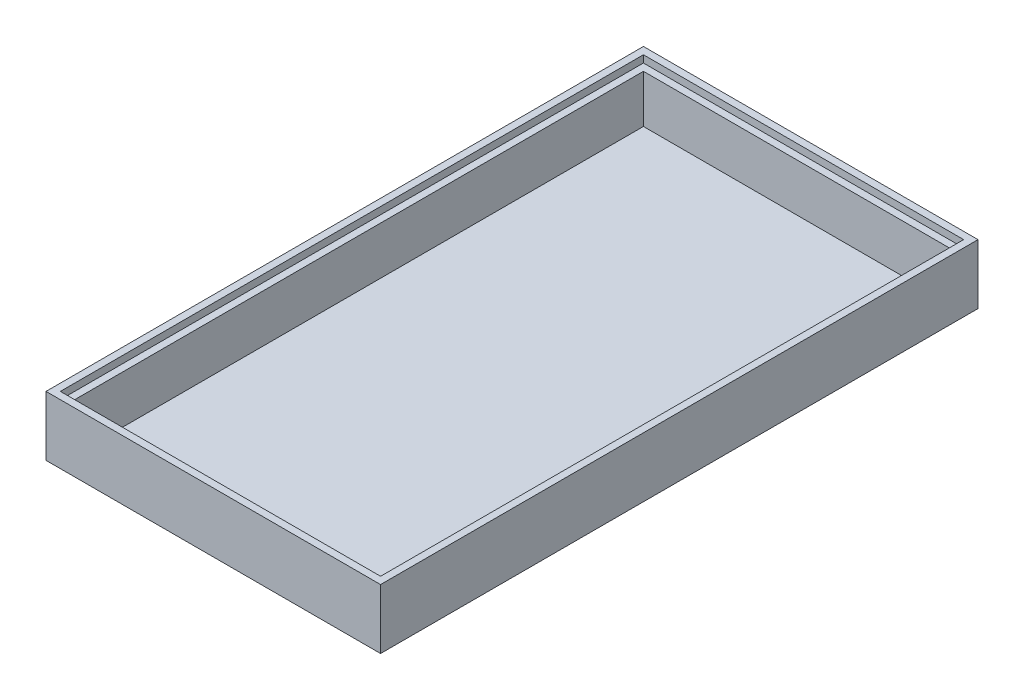
ISO-10303-21;
HEADER;
FILE_DESCRIPTION(('STEP AP214'),'2;1');
FILE_NAME('part.step','',(''),(''),'','','');
FILE_SCHEMA(('AUTOMOTIVE_DESIGN { 1 0 10303 214 1 1 1 1 }'));
ENDSEC;
DATA;
#1=APPLICATION_CONTEXT('core data for automotive mechanical design processes');
#2=APPLICATION_PROTOCOL_DEFINITION('international standard','automotive_design',2000,#1);
#3=PRODUCT_CONTEXT('',#1,'mechanical');
#4=PRODUCT('Part','Part','',(#3));
#5=PRODUCT_RELATED_PRODUCT_CATEGORY('part','',(#4));
#6=PRODUCT_DEFINITION_FORMATION('','',#4);
#7=PRODUCT_DEFINITION_CONTEXT('part definition',#1,'design');
#8=PRODUCT_DEFINITION('design','',#6,#7);
#9=PRODUCT_DEFINITION_SHAPE('','',#8);
#10=(LENGTH_UNIT() NAMED_UNIT(*) SI_UNIT(.MILLI.,.METRE.));
#11=(NAMED_UNIT(*) PLANE_ANGLE_UNIT() SI_UNIT($,.RADIAN.));
#12=(NAMED_UNIT(*) SI_UNIT($,.STERADIAN.) SOLID_ANGLE_UNIT());
#13=UNCERTAINTY_MEASURE_WITH_UNIT(LENGTH_MEASURE(1.E-05),#10,'distance_accuracy_value','');
#14=(GEOMETRIC_REPRESENTATION_CONTEXT(3) GLOBAL_UNCERTAINTY_ASSIGNED_CONTEXT((#13)) GLOBAL_UNIT_ASSIGNED_CONTEXT((#10,
#11,#12)) REPRESENTATION_CONTEXT('',''));
#15=CARTESIAN_POINT('',(0.,0.,0.));
#16=DIRECTION('',(0.,0.,1.));
#17=DIRECTION('',(1.,0.,0.));
#18=AXIS2_PLACEMENT_3D('',#15,#16,#17);
#19=CARTESIAN_POINT('',(-70.,25.,125.));
#20=DIRECTION('',(1.,0.,0.));
#21=DIRECTION('',(0.,0.,-1.));
#22=AXIS2_PLACEMENT_3D('',#19,#20,#21);
#23=PLANE('',#22);
#24=DIRECTION('',(0.,0.,1.));
#25=VECTOR('',#24,1.);
#26=CARTESIAN_POINT('',(-70.,0.,125.));
#27=LINE('',#26,#25);
#28=CARTESIAN_POINT('',(-70.,0.,-125.));
#29=VERTEX_POINT('',#28);
#30=CARTESIAN_POINT('',(-70.,0.,125.));
#31=VERTEX_POINT('',#30);
#32=EDGE_CURVE('E182',#29,#31,#27,.T.);
#33=ORIENTED_EDGE('',*,*,#32,.T.);
#34=DIRECTION('',(0.,-1.,0.));
#35=VECTOR('',#34,1.);
#36=CARTESIAN_POINT('',(-70.,25.,125.));
#37=LINE('',#36,#35);
#38=CARTESIAN_POINT('',(-70.,25.,125.));
#39=VERTEX_POINT('',#38);
#40=EDGE_CURVE('E41',#39,#31,#37,.T.);
#41=ORIENTED_EDGE('',*,*,#40,.F.);
#42=DIRECTION('',(0.,0.,1.));
#43=VECTOR('',#42,1.);
#44=CARTESIAN_POINT('',(-70.,25.,125.));
#45=LINE('',#44,#43);
#46=CARTESIAN_POINT('',(-70.,25.,-125.));
#47=VERTEX_POINT('',#46);
#48=EDGE_CURVE('E191',#47,#39,#45,.T.);
#49=ORIENTED_EDGE('',*,*,#48,.F.);
#50=DIRECTION('',(0.,-1.,0.));
#51=VECTOR('',#50,1.);
#52=CARTESIAN_POINT('',(-70.,25.,-125.));
#53=LINE('',#52,#51);
#54=EDGE_CURVE('E201',#47,#29,#53,.T.);
#55=ORIENTED_EDGE('',*,*,#54,.T.);
#56=EDGE_LOOP('',(#33,#41,#49,#55));
#57=FACE_BOUND('',#56,.T.);
#58=ADVANCED_FACE('F34',(#57),#23,.F.);
#59=CARTESIAN_POINT('',(70.,25.,125.));
#60=DIRECTION('',(0.,0.,-1.));
#61=DIRECTION('',(-1.,0.,0.));
#62=AXIS2_PLACEMENT_3D('',#59,#60,#61);
#63=PLANE('',#62);
#64=DIRECTION('',(1.,0.,0.));
#65=VECTOR('',#64,1.);
#66=CARTESIAN_POINT('',(70.,0.,125.));
#67=LINE('',#66,#65);
#68=CARTESIAN_POINT('',(70.,0.,125.));
#69=VERTEX_POINT('',#68);
#70=EDGE_CURVE('E204',#31,#69,#67,.T.);
#71=ORIENTED_EDGE('',*,*,#70,.T.);
#72=DIRECTION('',(0.,-1.,0.));
#73=VECTOR('',#72,1.);
#74=CARTESIAN_POINT('',(70.,25.,125.));
#75=LINE('',#74,#73);
#76=CARTESIAN_POINT('',(70.,25.,125.));
#77=VERTEX_POINT('',#76);
#78=EDGE_CURVE('E214',#77,#69,#75,.T.);
#79=ORIENTED_EDGE('',*,*,#78,.F.);
#80=DIRECTION('',(1.,0.,0.));
#81=VECTOR('',#80,1.);
#82=CARTESIAN_POINT('',(70.,25.,125.));
#83=LINE('',#82,#81);
#84=EDGE_CURVE('E194',#39,#77,#83,.T.);
#85=ORIENTED_EDGE('',*,*,#84,.F.);
#86=ORIENTED_EDGE('',*,*,#40,.T.);
#87=EDGE_LOOP('',(#71,#79,#85,#86));
#88=FACE_BOUND('',#87,.T.);
#89=ADVANCED_FACE('F219',(#88),#63,.F.);
#90=CARTESIAN_POINT('',(70.,25.,125.));
#91=DIRECTION('',(-1.,0.,0.));
#92=DIRECTION('',(0.,0.,1.));
#93=AXIS2_PLACEMENT_3D('',#90,#91,#92);
#94=PLANE('',#93);
#95=DIRECTION('',(0.,0.,-1.));
#96=VECTOR('',#95,1.);
#97=CARTESIAN_POINT('',(70.,0.,125.));
#98=LINE('',#97,#96);
#99=CARTESIAN_POINT('',(70.,0.,-125.));
#100=VERTEX_POINT('',#99);
#101=EDGE_CURVE('E206',#69,#100,#98,.T.);
#102=ORIENTED_EDGE('',*,*,#101,.T.);
#103=DIRECTION('',(0.,-1.,0.));
#104=VECTOR('',#103,1.);
#105=CARTESIAN_POINT('',(70.,25.,-125.));
#106=LINE('',#105,#104);
#107=CARTESIAN_POINT('',(70.,25.,-125.));
#108=VERTEX_POINT('',#107);
#109=EDGE_CURVE('E211',#108,#100,#106,.T.);
#110=ORIENTED_EDGE('',*,*,#109,.F.);
#111=DIRECTION('',(0.,0.,-1.));
#112=VECTOR('',#111,1.);
#113=CARTESIAN_POINT('',(70.,25.,125.));
#114=LINE('',#113,#112);
#115=EDGE_CURVE('E197',#77,#108,#114,.T.);
#116=ORIENTED_EDGE('',*,*,#115,.F.);
#117=ORIENTED_EDGE('',*,*,#78,.T.);
#118=EDGE_LOOP('',(#102,#110,#116,#117));
#119=FACE_BOUND('',#118,.T.);
#120=ADVANCED_FACE('F231',(#119),#94,.F.);
#121=CARTESIAN_POINT('',(70.,25.,-125.));
#122=DIRECTION('',(0.,0.,1.));
#123=DIRECTION('',(1.,0.,0.));
#124=AXIS2_PLACEMENT_3D('',#121,#122,#123);
#125=PLANE('',#124);
#126=DIRECTION('',(-1.,0.,0.));
#127=VECTOR('',#126,1.);
#128=CARTESIAN_POINT('',(70.,0.,-125.));
#129=LINE('',#128,#127);
#130=EDGE_CURVE('E195',#100,#29,#129,.T.);
#131=ORIENTED_EDGE('',*,*,#130,.T.);
#132=ORIENTED_EDGE('',*,*,#54,.F.);
#133=DIRECTION('',(-1.,0.,0.));
#134=VECTOR('',#133,1.);
#135=CARTESIAN_POINT('',(70.,25.,-125.));
#136=LINE('',#135,#134);
#137=EDGE_CURVE('E199',#108,#47,#136,.T.);
#138=ORIENTED_EDGE('',*,*,#137,.F.);
#139=ORIENTED_EDGE('',*,*,#109,.T.);
#140=EDGE_LOOP('',(#131,#132,#138,#139));
#141=FACE_BOUND('',#140,.T.);
#142=ADVANCED_FACE('F235',(#141),#125,.F.);
#143=CARTESIAN_POINT('',(0.,25.,0.));
#144=DIRECTION('',(0.,1.,0.));
#145=DIRECTION('',(0.,0.,1.));
#146=AXIS2_PLACEMENT_3D('',#143,#144,#145);
#147=PLANE('',#146);
#148=DIRECTION('',(0.,0.,1.));
#149=VECTOR('',#148,1.);
#150=CARTESIAN_POINT('',(-67.,25.,-122.));
#151=LINE('',#150,#149);
#152=CARTESIAN_POINT('',(-67.,25.,-122.));
#153=VERTEX_POINT('',#152);
#154=CARTESIAN_POINT('',(-67.,25.,122.));
#155=VERTEX_POINT('',#154);
#156=EDGE_CURVE('E48',#153,#155,#151,.T.);
#157=ORIENTED_EDGE('',*,*,#156,.F.);
#158=DIRECTION('',(-1.,0.,0.));
#159=VECTOR('',#158,1.);
#160=CARTESIAN_POINT('',(67.,25.,-122.));
#161=LINE('',#160,#159);
#162=CARTESIAN_POINT('',(67.,25.,-122.));
#163=VERTEX_POINT('',#162);
#164=EDGE_CURVE('E141',#163,#153,#161,.T.);
#165=ORIENTED_EDGE('',*,*,#164,.F.);
#166=DIRECTION('',(0.,0.,-1.));
#167=VECTOR('',#166,1.);
#168=CARTESIAN_POINT('',(67.,25.,-122.));
#169=LINE('',#168,#167);
#170=CARTESIAN_POINT('',(67.,25.,122.));
#171=VERTEX_POINT('',#170);
#172=EDGE_CURVE('E144',#171,#163,#169,.T.);
#173=ORIENTED_EDGE('',*,*,#172,.F.);
#174=DIRECTION('',(1.,0.,0.));
#175=VECTOR('',#174,1.);
#176=CARTESIAN_POINT('',(67.,25.,122.));
#177=LINE('',#176,#175);
#178=EDGE_CURVE('E150',#155,#171,#177,.T.);
#179=ORIENTED_EDGE('',*,*,#178,.F.);
#180=EDGE_LOOP('',(#157,#165,#173,#179));
#181=FACE_BOUND('',#180,.T.);
#182=ORIENTED_EDGE('',*,*,#48,.T.);
#183=ORIENTED_EDGE('',*,*,#84,.T.);
#184=ORIENTED_EDGE('',*,*,#115,.T.);
#185=ORIENTED_EDGE('',*,*,#137,.T.);
#186=EDGE_LOOP('',(#182,#183,#184,#185));
#187=FACE_BOUND('',#186,.T.);
#188=ADVANCED_FACE('F237',(#181,#187),#147,.T.);
#189=CARTESIAN_POINT('',(0.,0.,0.));
#190=DIRECTION('',(0.,1.,0.));
#191=DIRECTION('',(0.,0.,1.));
#192=AXIS2_PLACEMENT_3D('',#189,#190,#191);
#193=PLANE('',#192);
#194=ORIENTED_EDGE('',*,*,#32,.F.);
#195=ORIENTED_EDGE('',*,*,#130,.F.);
#196=ORIENTED_EDGE('',*,*,#101,.F.);
#197=ORIENTED_EDGE('',*,*,#70,.F.);
#198=EDGE_LOOP('',(#194,#195,#196,#197));
#199=FACE_BOUND('',#198,.T.);
#200=ADVANCED_FACE('F227',(#199),#193,.F.);
#201=CARTESIAN_POINT('',(0.,22.,0.));
#202=DIRECTION('',(0.,-1.,0.));
#203=DIRECTION('',(0.,0.,-1.));
#204=AXIS2_PLACEMENT_3D('',#201,#202,#203);
#205=PLANE('',#204);
#206=DIRECTION('',(0.,0.,1.));
#207=VECTOR('',#206,1.);
#208=CARTESIAN_POINT('',(-67.,22.,-122.));
#209=LINE('',#208,#207);
#210=CARTESIAN_POINT('',(-67.,22.,-122.));
#211=VERTEX_POINT('',#210);
#212=CARTESIAN_POINT('',(-67.,22.,122.));
#213=VERTEX_POINT('',#212);
#214=EDGE_CURVE('E123',#211,#213,#209,.T.);
#215=ORIENTED_EDGE('',*,*,#214,.T.);
#216=DIRECTION('',(1.,0.,0.));
#217=VECTOR('',#216,1.);
#218=CARTESIAN_POINT('',(67.,22.,122.));
#219=LINE('',#218,#217);
#220=CARTESIAN_POINT('',(67.,22.,122.));
#221=VERTEX_POINT('',#220);
#222=EDGE_CURVE('E132',#213,#221,#219,.T.);
#223=ORIENTED_EDGE('',*,*,#222,.T.);
#224=DIRECTION('',(0.,0.,-1.));
#225=VECTOR('',#224,1.);
#226=CARTESIAN_POINT('',(67.,22.,-122.));
#227=LINE('',#226,#225);
#228=CARTESIAN_POINT('',(67.,22.,-122.));
#229=VERTEX_POINT('',#228);
#230=EDGE_CURVE('E137',#221,#229,#227,.T.);
#231=ORIENTED_EDGE('',*,*,#230,.T.);
#232=DIRECTION('',(-1.,0.,0.));
#233=VECTOR('',#232,1.);
#234=CARTESIAN_POINT('',(67.,22.,-122.));
#235=LINE('',#234,#233);
#236=EDGE_CURVE('E129',#229,#211,#235,.T.);
#237=ORIENTED_EDGE('',*,*,#236,.T.);
#238=EDGE_LOOP('',(#215,#223,#231,#237));
#239=FACE_BOUND('',#238,.T.);
#240=DIRECTION('',(-1.,0.,0.));
#241=VECTOR('',#240,1.);
#242=CARTESIAN_POINT('',(64.,22.,-119.));
#243=LINE('',#242,#241);
#244=CARTESIAN_POINT('',(64.,22.,-119.));
#245=VERTEX_POINT('',#244);
#246=CARTESIAN_POINT('',(-64.,22.,-119.));
#247=VERTEX_POINT('',#246);
#248=EDGE_CURVE('E160',#245,#247,#243,.T.);
#249=ORIENTED_EDGE('',*,*,#248,.F.);
#250=DIRECTION('',(0.,0.,-1.));
#251=VECTOR('',#250,1.);
#252=CARTESIAN_POINT('',(64.,22.,119.));
#253=LINE('',#252,#251);
#254=CARTESIAN_POINT('',(64.,22.,119.));
#255=VERTEX_POINT('',#254);
#256=EDGE_CURVE('E56',#255,#245,#253,.T.);
#257=ORIENTED_EDGE('',*,*,#256,.F.);
#258=DIRECTION('',(1.,0.,0.));
#259=VECTOR('',#258,1.);
#260=CARTESIAN_POINT('',(64.,22.,119.));
#261=LINE('',#260,#259);
#262=CARTESIAN_POINT('',(-64.,22.,119.));
#263=VERTEX_POINT('',#262);
#264=EDGE_CURVE('E11',#263,#255,#261,.T.);
#265=ORIENTED_EDGE('',*,*,#264,.F.);
#266=DIRECTION('',(0.,0.,1.));
#267=VECTOR('',#266,1.);
#268=CARTESIAN_POINT('',(-64.,22.,119.));
#269=LINE('',#268,#267);
#270=EDGE_CURVE('E163',#247,#263,#269,.T.);
#271=ORIENTED_EDGE('',*,*,#270,.F.);
#272=EDGE_LOOP('',(#249,#257,#265,#271));
#273=FACE_BOUND('',#272,.T.);
#274=ADVANCED_FACE('F139',(#239,#273),#205,.F.);
#275=CARTESIAN_POINT('',(-67.,22.,-122.));
#276=DIRECTION('',(-1.,0.,0.));
#277=DIRECTION('',(0.,0.,1.));
#278=AXIS2_PLACEMENT_3D('',#275,#276,#277);
#279=PLANE('',#278);
#280=ORIENTED_EDGE('',*,*,#156,.T.);
#281=DIRECTION('',(0.,1.,0.));
#282=VECTOR('',#281,1.);
#283=CARTESIAN_POINT('',(-67.,22.,122.));
#284=LINE('',#283,#282);
#285=EDGE_CURVE('E119',#213,#155,#284,.T.);
#286=ORIENTED_EDGE('',*,*,#285,.F.);
#287=ORIENTED_EDGE('',*,*,#214,.F.);
#288=DIRECTION('',(0.,1.,0.));
#289=VECTOR('',#288,1.);
#290=CARTESIAN_POINT('',(-67.,22.,-122.));
#291=LINE('',#290,#289);
#292=EDGE_CURVE('E154',#211,#153,#291,.T.);
#293=ORIENTED_EDGE('',*,*,#292,.T.);
#294=EDGE_LOOP('',(#280,#286,#287,#293));
#295=FACE_BOUND('',#294,.T.);
#296=ADVANCED_FACE('F121',(#295),#279,.F.);
#297=CARTESIAN_POINT('',(67.,22.,-122.));
#298=DIRECTION('',(0.,0.,-1.));
#299=DIRECTION('',(-1.,0.,0.));
#300=AXIS2_PLACEMENT_3D('',#297,#298,#299);
#301=PLANE('',#300);
#302=ORIENTED_EDGE('',*,*,#164,.T.);
#303=ORIENTED_EDGE('',*,*,#292,.F.);
#304=ORIENTED_EDGE('',*,*,#236,.F.);
#305=DIRECTION('',(0.,1.,0.));
#306=VECTOR('',#305,1.);
#307=CARTESIAN_POINT('',(67.,22.,-122.));
#308=LINE('',#307,#306);
#309=EDGE_CURVE('E156',#229,#163,#308,.T.);
#310=ORIENTED_EDGE('',*,*,#309,.T.);
#311=EDGE_LOOP('',(#302,#303,#304,#310));
#312=FACE_BOUND('',#311,.T.);
#313=ADVANCED_FACE('F304',(#312),#301,.F.);
#314=CARTESIAN_POINT('',(67.,22.,-122.));
#315=DIRECTION('',(1.,0.,0.));
#316=DIRECTION('',(0.,0.,-1.));
#317=AXIS2_PLACEMENT_3D('',#314,#315,#316);
#318=PLANE('',#317);
#319=ORIENTED_EDGE('',*,*,#172,.T.);
#320=ORIENTED_EDGE('',*,*,#309,.F.);
#321=ORIENTED_EDGE('',*,*,#230,.F.);
#322=DIRECTION('',(0.,1.,0.));
#323=VECTOR('',#322,1.);
#324=CARTESIAN_POINT('',(67.,22.,122.));
#325=LINE('',#324,#323);
#326=EDGE_CURVE('E128',#221,#171,#325,.T.);
#327=ORIENTED_EDGE('',*,*,#326,.T.);
#328=EDGE_LOOP('',(#319,#320,#321,#327));
#329=FACE_BOUND('',#328,.T.);
#330=ADVANCED_FACE('F313',(#329),#318,.F.);
#331=CARTESIAN_POINT('',(67.,22.,122.));
#332=DIRECTION('',(0.,0.,1.));
#333=DIRECTION('',(1.,0.,0.));
#334=AXIS2_PLACEMENT_3D('',#331,#332,#333);
#335=PLANE('',#334);
#336=ORIENTED_EDGE('',*,*,#178,.T.);
#337=ORIENTED_EDGE('',*,*,#326,.F.);
#338=ORIENTED_EDGE('',*,*,#222,.F.);
#339=ORIENTED_EDGE('',*,*,#285,.T.);
#340=EDGE_LOOP('',(#336,#337,#338,#339));
#341=FACE_BOUND('',#340,.T.);
#342=ADVANCED_FACE('F133',(#341),#335,.F.);
#343=CARTESIAN_POINT('',(0.,2.,0.));
#344=DIRECTION('',(0.,1.,0.));
#345=DIRECTION('',(0.,0.,1.));
#346=AXIS2_PLACEMENT_3D('',#343,#344,#345);
#347=PLANE('',#346);
#348=DIRECTION('',(0.,0.,1.));
#349=VECTOR('',#348,1.);
#350=CARTESIAN_POINT('',(-64.,2.,119.));
#351=LINE('',#350,#349);
#352=CARTESIAN_POINT('',(-64.,2.,-119.));
#353=VERTEX_POINT('',#352);
#354=CARTESIAN_POINT('',(-64.,2.,119.));
#355=VERTEX_POINT('',#354);
#356=EDGE_CURVE('E166',#353,#355,#351,.T.);
#357=ORIENTED_EDGE('',*,*,#356,.T.);
#358=DIRECTION('',(1.,0.,0.));
#359=VECTOR('',#358,1.);
#360=CARTESIAN_POINT('',(64.,2.,119.));
#361=LINE('',#360,#359);
#362=CARTESIAN_POINT('',(64.,2.,119.));
#363=VERTEX_POINT('',#362);
#364=EDGE_CURVE('E169',#355,#363,#361,.T.);
#365=ORIENTED_EDGE('',*,*,#364,.T.);
#366=DIRECTION('',(0.,0.,-1.));
#367=VECTOR('',#366,1.);
#368=CARTESIAN_POINT('',(64.,2.,119.));
#369=LINE('',#368,#367);
#370=CARTESIAN_POINT('',(64.,2.,-119.));
#371=VERTEX_POINT('',#370);
#372=EDGE_CURVE('E172',#363,#371,#369,.T.);
#373=ORIENTED_EDGE('',*,*,#372,.T.);
#374=DIRECTION('',(-1.,0.,0.));
#375=VECTOR('',#374,1.);
#376=CARTESIAN_POINT('',(64.,2.,-119.));
#377=LINE('',#376,#375);
#378=EDGE_CURVE('E175',#371,#353,#377,.T.);
#379=ORIENTED_EDGE('',*,*,#378,.T.);
#380=EDGE_LOOP('',(#357,#365,#373,#379));
#381=FACE_BOUND('',#380,.T.);
#382=ADVANCED_FACE('F276',(#381),#347,.T.);
#383=CARTESIAN_POINT('',(64.,2.,119.));
#384=DIRECTION('',(0.,0.,1.));
#385=DIRECTION('',(1.,0.,0.));
#386=AXIS2_PLACEMENT_3D('',#383,#384,#385);
#387=PLANE('',#386);
#388=DIRECTION('',(0.,1.,0.));
#389=VECTOR('',#388,1.);
#390=CARTESIAN_POINT('',(-64.,2.,119.));
#391=LINE('',#390,#389);
#392=EDGE_CURVE('E178',#355,#263,#391,.T.);
#393=ORIENTED_EDGE('',*,*,#392,.T.);
#394=ORIENTED_EDGE('',*,*,#264,.T.);
#395=DIRECTION('',(0.,1.,0.));
#396=VECTOR('',#395,1.);
#397=CARTESIAN_POINT('',(64.,2.,119.));
#398=LINE('',#397,#396);
#399=EDGE_CURVE('E186',#363,#255,#398,.T.);
#400=ORIENTED_EDGE('',*,*,#399,.F.);
#401=ORIENTED_EDGE('',*,*,#364,.F.);
#402=EDGE_LOOP('',(#393,#394,#400,#401));
#403=FACE_BOUND('',#402,.T.);
#404=ADVANCED_FACE('F280',(#403),#387,.F.);
#405=CARTESIAN_POINT('',(64.,2.,119.));
#406=DIRECTION('',(1.,0.,0.));
#407=DIRECTION('',(0.,0.,-1.));
#408=AXIS2_PLACEMENT_3D('',#405,#406,#407);
#409=PLANE('',#408);
#410=ORIENTED_EDGE('',*,*,#399,.T.);
#411=ORIENTED_EDGE('',*,*,#256,.T.);
#412=DIRECTION('',(0.,1.,0.));
#413=VECTOR('',#412,1.);
#414=CARTESIAN_POINT('',(64.,2.,-119.));
#415=LINE('',#414,#413);
#416=EDGE_CURVE('E183',#371,#245,#415,.T.);
#417=ORIENTED_EDGE('',*,*,#416,.F.);
#418=ORIENTED_EDGE('',*,*,#372,.F.);
#419=EDGE_LOOP('',(#410,#411,#417,#418));
#420=FACE_BOUND('',#419,.T.);
#421=ADVANCED_FACE('F337',(#420),#409,.F.);
#422=CARTESIAN_POINT('',(64.,2.,-119.));
#423=DIRECTION('',(0.,0.,-1.));
#424=DIRECTION('',(-1.,0.,0.));
#425=AXIS2_PLACEMENT_3D('',#422,#423,#424);
#426=PLANE('',#425);
#427=ORIENTED_EDGE('',*,*,#416,.T.);
#428=ORIENTED_EDGE('',*,*,#248,.T.);
#429=DIRECTION('',(0.,1.,0.));
#430=VECTOR('',#429,1.);
#431=CARTESIAN_POINT('',(-64.,2.,-119.));
#432=LINE('',#431,#430);
#433=EDGE_CURVE('E179',#353,#247,#432,.T.);
#434=ORIENTED_EDGE('',*,*,#433,.F.);
#435=ORIENTED_EDGE('',*,*,#378,.F.);
#436=EDGE_LOOP('',(#427,#428,#434,#435));
#437=FACE_BOUND('',#436,.T.);
#438=ADVANCED_FACE('F347',(#437),#426,.F.);
#439=CARTESIAN_POINT('',(-64.,2.,119.));
#440=DIRECTION('',(-1.,0.,0.));
#441=DIRECTION('',(0.,0.,1.));
#442=AXIS2_PLACEMENT_3D('',#439,#440,#441);
#443=PLANE('',#442);
#444=ORIENTED_EDGE('',*,*,#433,.T.);
#445=ORIENTED_EDGE('',*,*,#270,.T.);
#446=ORIENTED_EDGE('',*,*,#392,.F.);
#447=ORIENTED_EDGE('',*,*,#356,.F.);
#448=EDGE_LOOP('',(#444,#445,#446,#447));
#449=FACE_BOUND('',#448,.T.);
#450=ADVANCED_FACE('F357',(#449),#443,.F.);
#451=CLOSED_SHELL('',(#58,#89,#120,#142,#188,#200,#274,#296,#313,#330,#342,#382,#404,#421,#438,#450));
#452=MANIFOLD_SOLID_BREP('B2',#451);
#453=ADVANCED_BREP_SHAPE_REPRESENTATION('',(#18,#452),#14);
#454=SHAPE_DEFINITION_REPRESENTATION(#9,#453);
ENDSEC;
END-ISO-10303-21;
